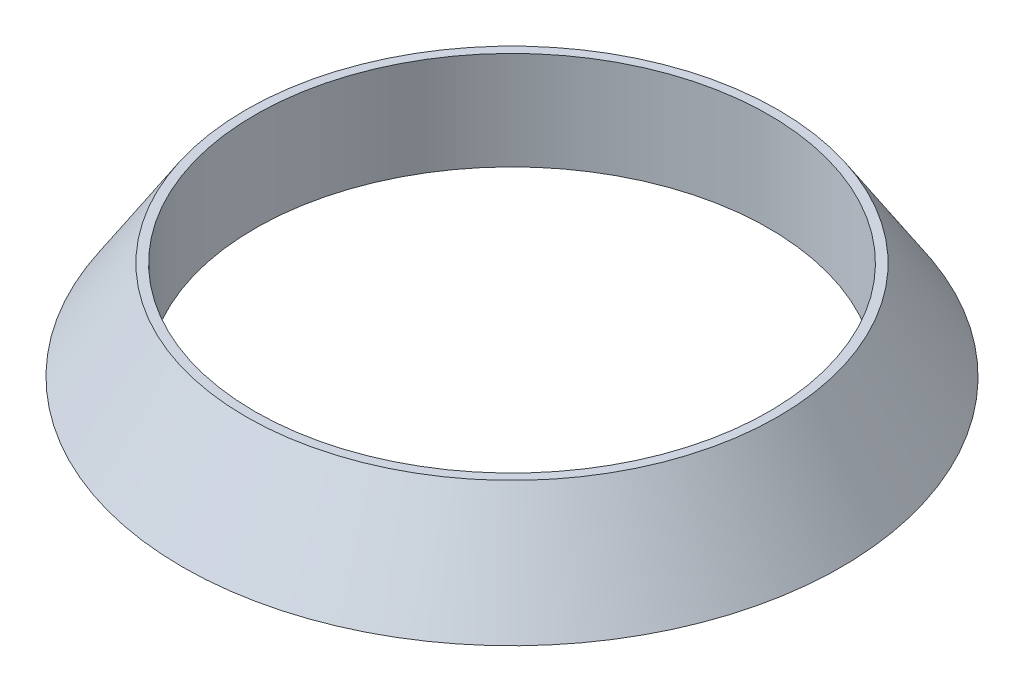
ISO-10303-21;
HEADER;
FILE_DESCRIPTION(('STEP AP214'),'2;1');
FILE_NAME('part.step','',(''),(''),'','','');
FILE_SCHEMA(('AUTOMOTIVE_DESIGN { 1 0 10303 214 1 1 1 1 }'));
ENDSEC;
DATA;
#1=APPLICATION_CONTEXT('core data for automotive mechanical design processes');
#2=APPLICATION_PROTOCOL_DEFINITION('international standard','automotive_design',2000,#1);
#3=PRODUCT_CONTEXT('',#1,'mechanical');
#4=PRODUCT('Part','Part','',(#3));
#5=PRODUCT_RELATED_PRODUCT_CATEGORY('part','',(#4));
#6=PRODUCT_DEFINITION_FORMATION('','',#4);
#7=PRODUCT_DEFINITION_CONTEXT('part definition',#1,'design');
#8=PRODUCT_DEFINITION('design','',#6,#7);
#9=PRODUCT_DEFINITION_SHAPE('','',#8);
#10=(LENGTH_UNIT() NAMED_UNIT(*) SI_UNIT(.MILLI.,.METRE.));
#11=(NAMED_UNIT(*) PLANE_ANGLE_UNIT() SI_UNIT($,.RADIAN.));
#12=(NAMED_UNIT(*) SI_UNIT($,.STERADIAN.) SOLID_ANGLE_UNIT());
#13=UNCERTAINTY_MEASURE_WITH_UNIT(LENGTH_MEASURE(1.E-05),#10,'distance_accuracy_value','');
#14=(GEOMETRIC_REPRESENTATION_CONTEXT(3) GLOBAL_UNCERTAINTY_ASSIGNED_CONTEXT((#13)) GLOBAL_UNIT_ASSIGNED_CONTEXT((#10,
#11,#12)) REPRESENTATION_CONTEXT('',''));
#15=CARTESIAN_POINT('',(0.,0.,0.));
#16=DIRECTION('',(0.,0.,1.));
#17=DIRECTION('',(1.,0.,0.));
#18=AXIS2_PLACEMENT_3D('',#15,#16,#17);
#19=CARTESIAN_POINT('',(0.,25.4,0.));
#20=DIRECTION('',(0.,1.,0.));
#21=DIRECTION('',(0.,0.,1.));
#22=AXIS2_PLACEMENT_3D('',#19,#20,#21);
#23=PLANE('',#22);
#24=CARTESIAN_POINT('',(0.,25.4,0.));
#25=DIRECTION('',(0.,1.,0.));
#26=DIRECTION('',(0.,0.,1.));
#27=AXIS2_PLACEMENT_3D('',#24,#25,#26);
#28=CIRCLE('',#27,66.416308436642);
#29=CARTESIAN_POINT('',(0.,25.4,66.416308436642));
#30=VERTEX_POINT('',#29);
#31=EDGE_CURVE('E10',#30,#30,#28,.T.);
#32=ORIENTED_EDGE('',*,*,#31,.F.);
#33=EDGE_LOOP('',(#32));
#34=FACE_BOUND('',#33,.T.);
#35=CARTESIAN_POINT('',(0.,25.4,0.));
#36=DIRECTION('',(0.,-1.,0.));
#37=DIRECTION('',(0.,0.,-1.));
#38=AXIS2_PLACEMENT_3D('',#35,#36,#37);
#39=CIRCLE('',#38,68.7323114025598);
#40=CARTESIAN_POINT('',(0.,25.4,-68.7323114025598));
#41=VERTEX_POINT('',#40);
#42=EDGE_CURVE('E42',#41,#41,#39,.T.);
#43=ORIENTED_EDGE('',*,*,#42,.F.);
#44=EDGE_LOOP('',(#43));
#45=FACE_BOUND('',#44,.T.);
#46=ADVANCED_FACE('F31',(#34,#45),#23,.T.);
#47=CARTESIAN_POINT('',(0.,0.,0.));
#48=DIRECTION('',(0.,1.,0.));
#49=DIRECTION('',(0.,0.,1.));
#50=AXIS2_PLACEMENT_3D('',#47,#48,#49);
#51=PLANE('',#50);
#52=CARTESIAN_POINT('',(0.,0.,0.));
#53=DIRECTION('',(0.,-1.,0.));
#54=DIRECTION('',(0.,0.,-1.));
#55=AXIS2_PLACEMENT_3D('',#52,#53,#54);
#56=CIRCLE('',#55,85.1665034197313);
#57=CARTESIAN_POINT('',(0.,0.,-85.1665034197313));
#58=VERTEX_POINT('',#57);
#59=EDGE_CURVE('E46',#58,#58,#56,.T.);
#60=ORIENTED_EDGE('',*,*,#59,.T.);
#61=EDGE_LOOP('',(#60));
#62=FACE_BOUND('',#61,.T.);
#63=CARTESIAN_POINT('',(0.,0.,0.));
#64=DIRECTION('',(0.,1.,0.));
#65=DIRECTION('',(0.,0.,1.));
#66=AXIS2_PLACEMENT_3D('',#63,#64,#65);
#67=CIRCLE('',#66,66.416308436642);
#68=CARTESIAN_POINT('',(0.,0.,66.416308436642));
#69=VERTEX_POINT('',#68);
#70=EDGE_CURVE('E35',#69,#69,#67,.T.);
#71=ORIENTED_EDGE('',*,*,#70,.T.);
#72=EDGE_LOOP('',(#71));
#73=FACE_BOUND('',#72,.T.);
#74=ADVANCED_FACE('F33',(#62,#73),#51,.F.);
#75=CARTESIAN_POINT('',(0.,25.4,0.));
#76=DIRECTION('',(0.,-1.,0.));
#77=DIRECTION('',(0.,0.,-1.));
#78=AXIS2_PLACEMENT_3D('',#75,#76,#77);
#79=CYLINDRICAL_SURFACE('',#78,66.416308436642);
#80=ORIENTED_EDGE('',*,*,#31,.T.);
#81=EDGE_LOOP('',(#80));
#82=FACE_BOUND('',#81,.T.);
#83=ORIENTED_EDGE('',*,*,#70,.F.);
#84=EDGE_LOOP('',(#83));
#85=FACE_BOUND('',#84,.T.);
#86=ADVANCED_FACE('F54',(#82,#85),#79,.F.);
#87=CARTESIAN_POINT('',(0.,0.,0.));
#88=DIRECTION('',(0.,-1.,0.));
#89=DIRECTION('',(0.,0.,-1.));
#90=AXIS2_PLACEMENT_3D('',#87,#88,#89);
#91=CONICAL_SURFACE('',#90,85.1665034197313,0.574274245064204);
#92=ORIENTED_EDGE('',*,*,#42,.T.);
#93=EDGE_LOOP('',(#92));
#94=FACE_BOUND('',#93,.T.);
#95=ORIENTED_EDGE('',*,*,#59,.F.);
#96=EDGE_LOOP('',(#95));
#97=FACE_BOUND('',#96,.T.);
#98=ADVANCED_FACE('F52',(#94,#97),#91,.T.);
#99=CLOSED_SHELL('',(#46,#74,#86,#98));
#100=MANIFOLD_SOLID_BREP('B2',#99);
#101=ADVANCED_BREP_SHAPE_REPRESENTATION('',(#18,#100),#14);
#102=SHAPE_DEFINITION_REPRESENTATION(#9,#101);
ENDSEC;
END-ISO-10303-21;
